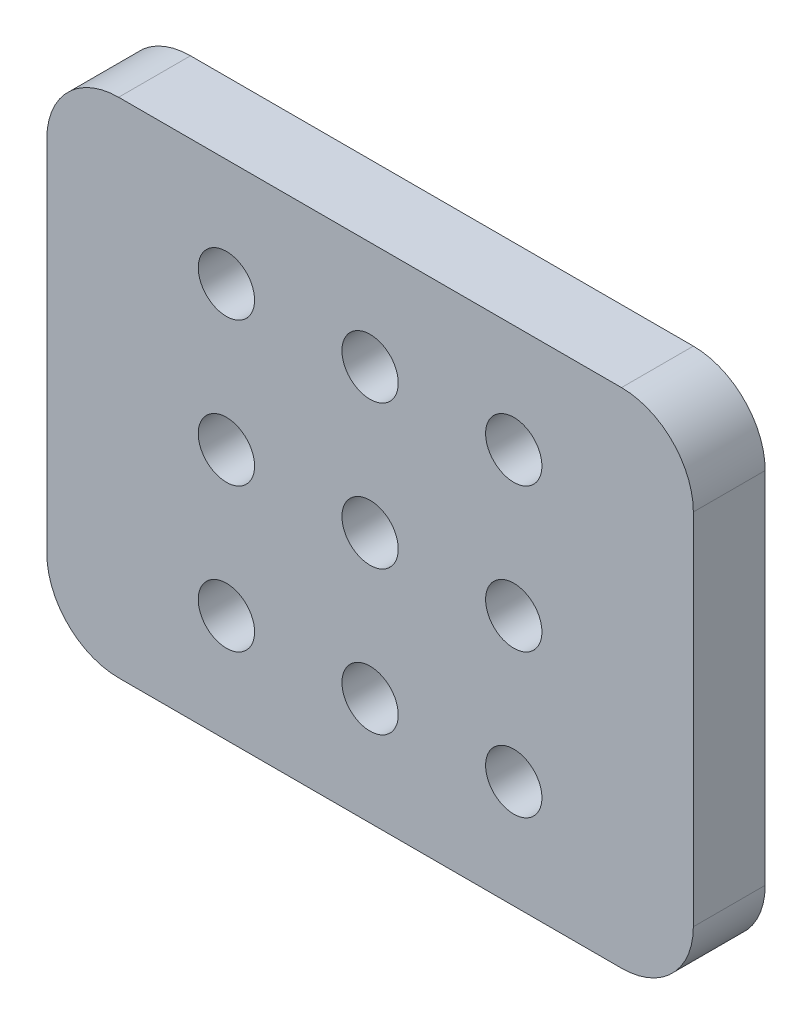
ISO-10303-21;
HEADER;
FILE_DESCRIPTION(('STEP AP214'),'2;1');
FILE_NAME('part.step','',(''),(''),'','','');
FILE_SCHEMA(('AUTOMOTIVE_DESIGN { 1 0 10303 214 1 1 1 1 }'));
ENDSEC;
DATA;
#1=APPLICATION_CONTEXT('core data for automotive mechanical design processes');
#2=APPLICATION_PROTOCOL_DEFINITION('international standard','automotive_design',2000,#1);
#3=PRODUCT_CONTEXT('',#1,'mechanical');
#4=PRODUCT('Part','Part','',(#3));
#5=PRODUCT_RELATED_PRODUCT_CATEGORY('part','',(#4));
#6=PRODUCT_DEFINITION_FORMATION('','',#4);
#7=PRODUCT_DEFINITION_CONTEXT('part definition',#1,'design');
#8=PRODUCT_DEFINITION('design','',#6,#7);
#9=PRODUCT_DEFINITION_SHAPE('','',#8);
#10=(LENGTH_UNIT() NAMED_UNIT(*) SI_UNIT(.MILLI.,.METRE.));
#11=(NAMED_UNIT(*) PLANE_ANGLE_UNIT() SI_UNIT($,.RADIAN.));
#12=(NAMED_UNIT(*) SI_UNIT($,.STERADIAN.) SOLID_ANGLE_UNIT());
#13=UNCERTAINTY_MEASURE_WITH_UNIT(LENGTH_MEASURE(1.E-05),#10,'distance_accuracy_value','');
#14=(GEOMETRIC_REPRESENTATION_CONTEXT(3) GLOBAL_UNCERTAINTY_ASSIGNED_CONTEXT((#13)) GLOBAL_UNIT_ASSIGNED_CONTEXT((#10,
#11,#12)) REPRESENTATION_CONTEXT('',''));
#15=CARTESIAN_POINT('',(0.,0.,0.));
#16=DIRECTION('',(0.,0.,1.));
#17=DIRECTION('',(1.,0.,0.));
#18=AXIS2_PLACEMENT_3D('',#15,#16,#17);
#19=CARTESIAN_POINT('',(0.,47.625,3.175));
#20=DIRECTION('',(0.,1.,0.));
#21=DIRECTION('',(0.,0.,1.));
#22=AXIS2_PLACEMENT_3D('',#19,#20,#21);
#23=PLANE('',#22);
#24=DIRECTION('',(1.,0.,0.));
#25=VECTOR('',#24,1.);
#26=CARTESIAN_POINT('',(0.,47.625,-3.175));
#27=LINE('',#26,#25);
#28=CARTESIAN_POINT('',(9.525,47.625,-3.175));
#29=VERTEX_POINT('',#28);
#30=CARTESIAN_POINT('',(53.975,47.625,-3.175));
#31=VERTEX_POINT('',#30);
#32=EDGE_CURVE('E170',#29,#31,#27,.T.);
#33=ORIENTED_EDGE('',*,*,#32,.F.);
#34=DIRECTION('',(0.,0.,-1.));
#35=VECTOR('',#34,1.);
#36=CARTESIAN_POINT('',(9.525,47.625,3.175));
#37=LINE('',#36,#35);
#38=CARTESIAN_POINT('',(9.525,47.625,3.175));
#39=VERTEX_POINT('',#38);
#40=EDGE_CURVE('E11',#29,#39,#37,.F.);
#41=ORIENTED_EDGE('',*,*,#40,.T.);
#42=DIRECTION('',(1.,0.,0.));
#43=VECTOR('',#42,1.);
#44=CARTESIAN_POINT('',(0.,47.625,3.175));
#45=LINE('',#44,#43);
#46=CARTESIAN_POINT('',(53.975,47.625,3.175));
#47=VERTEX_POINT('',#46);
#48=EDGE_CURVE('E172',#39,#47,#45,.T.);
#49=ORIENTED_EDGE('',*,*,#48,.T.);
#50=DIRECTION('',(0.,0.,-1.));
#51=VECTOR('',#50,1.);
#52=CARTESIAN_POINT('',(53.975,47.625,-3.175));
#53=LINE('',#52,#51);
#54=EDGE_CURVE('E45',#47,#31,#53,.T.);
#55=ORIENTED_EDGE('',*,*,#54,.T.);
#56=EDGE_LOOP('',(#33,#41,#49,#55));
#57=FACE_BOUND('',#56,.T.);
#58=ADVANCED_FACE('F37',(#57),#23,.T.);
#59=CARTESIAN_POINT('',(3.175,0.,3.175));
#60=DIRECTION('',(-1.,0.,0.));
#61=DIRECTION('',(0.,0.,1.));
#62=AXIS2_PLACEMENT_3D('',#59,#60,#61);
#63=PLANE('',#62);
#64=DIRECTION('',(0.,1.,0.));
#65=VECTOR('',#64,1.);
#66=CARTESIAN_POINT('',(3.175,0.,-3.175));
#67=LINE('',#66,#65);
#68=CARTESIAN_POINT('',(3.175,9.525,-3.175));
#69=VERTEX_POINT('',#68);
#70=CARTESIAN_POINT('',(3.175,41.275,-3.175));
#71=VERTEX_POINT('',#70);
#72=EDGE_CURVE('E136',#69,#71,#67,.T.);
#73=ORIENTED_EDGE('',*,*,#72,.F.);
#74=DIRECTION('',(0.,0.,-1.));
#75=VECTOR('',#74,1.);
#76=CARTESIAN_POINT('',(3.175,9.525,3.175));
#77=LINE('',#76,#75);
#78=CARTESIAN_POINT('',(3.175,9.525,3.175));
#79=VERTEX_POINT('',#78);
#80=EDGE_CURVE('E59',#69,#79,#77,.F.);
#81=ORIENTED_EDGE('',*,*,#80,.T.);
#82=DIRECTION('',(0.,1.,0.));
#83=VECTOR('',#82,1.);
#84=CARTESIAN_POINT('',(3.175,0.,3.175));
#85=LINE('',#84,#83);
#86=CARTESIAN_POINT('',(3.175,41.275,3.175));
#87=VERTEX_POINT('',#86);
#88=EDGE_CURVE('E208',#79,#87,#85,.T.);
#89=ORIENTED_EDGE('',*,*,#88,.T.);
#90=DIRECTION('',(0.,0.,-1.));
#91=VECTOR('',#90,1.);
#92=CARTESIAN_POINT('',(3.175,41.275,3.175));
#93=LINE('',#92,#91);
#94=EDGE_CURVE('E162',#87,#71,#93,.T.);
#95=ORIENTED_EDGE('',*,*,#94,.T.);
#96=EDGE_LOOP('',(#73,#81,#89,#95));
#97=FACE_BOUND('',#96,.T.);
#98=ADVANCED_FACE('F269',(#97),#63,.T.);
#99=CARTESIAN_POINT('',(0.,3.175,3.175));
#100=DIRECTION('',(0.,1.,0.));
#101=DIRECTION('',(0.,0.,1.));
#102=AXIS2_PLACEMENT_3D('',#99,#100,#101);
#103=PLANE('',#102);
#104=DIRECTION('',(1.,0.,0.));
#105=VECTOR('',#104,1.);
#106=CARTESIAN_POINT('',(0.,3.175,-3.175));
#107=LINE('',#106,#105);
#108=CARTESIAN_POINT('',(9.525,3.175,-3.175));
#109=VERTEX_POINT('',#108);
#110=CARTESIAN_POINT('',(53.975,3.175,-3.175));
#111=VERTEX_POINT('',#110);
#112=EDGE_CURVE('E131',#109,#111,#107,.T.);
#113=ORIENTED_EDGE('',*,*,#112,.T.);
#114=DIRECTION('',(0.,0.,-1.));
#115=VECTOR('',#114,1.);
#116=CARTESIAN_POINT('',(53.975,3.175,3.175));
#117=LINE('',#116,#115);
#118=CARTESIAN_POINT('',(53.975,3.175,3.175));
#119=VERTEX_POINT('',#118);
#120=EDGE_CURVE('E108',#111,#119,#117,.F.);
#121=ORIENTED_EDGE('',*,*,#120,.T.);
#122=DIRECTION('',(1.,0.,0.));
#123=VECTOR('',#122,1.);
#124=CARTESIAN_POINT('',(0.,3.175,3.175));
#125=LINE('',#124,#123);
#126=CARTESIAN_POINT('',(9.525,3.175,3.175));
#127=VERTEX_POINT('',#126);
#128=EDGE_CURVE('E205',#127,#119,#125,.T.);
#129=ORIENTED_EDGE('',*,*,#128,.F.);
#130=DIRECTION('',(0.,0.,-1.));
#131=VECTOR('',#130,1.);
#132=CARTESIAN_POINT('',(9.525,3.175,-3.175));
#133=LINE('',#132,#131);
#134=EDGE_CURVE('E113',#127,#109,#133,.T.);
#135=ORIENTED_EDGE('',*,*,#134,.T.);
#136=EDGE_LOOP('',(#113,#121,#129,#135));
#137=FACE_BOUND('',#136,.T.);
#138=ADVANCED_FACE('F274',(#137),#103,.F.);
#139=CARTESIAN_POINT('',(19.05,25.3999999999999,3.175));
#140=DIRECTION('',(0.,0.,-1.));
#141=DIRECTION('',(-1.,0.,0.));
#142=AXIS2_PLACEMENT_3D('',#139,#140,#141);
#143=CYLINDRICAL_SURFACE('',#142,2.4892);
#144=CARTESIAN_POINT('',(19.05,25.3999999999999,3.175));
#145=DIRECTION('',(0.,0.,1.));
#146=DIRECTION('',(1.,0.,0.));
#147=AXIS2_PLACEMENT_3D('',#144,#145,#146);
#148=CIRCLE('',#147,2.4892);
#149=CARTESIAN_POINT('',(21.5392,25.3999999999999,3.175));
#150=VERTEX_POINT('',#149);
#151=EDGE_CURVE('E198',#150,#150,#148,.T.);
#152=ORIENTED_EDGE('',*,*,#151,.T.);
#153=EDGE_LOOP('',(#152));
#154=FACE_BOUND('',#153,.T.);
#155=CARTESIAN_POINT('',(19.05,25.3999999999999,-3.175));
#156=DIRECTION('',(0.,0.,1.));
#157=DIRECTION('',(1.,0.,0.));
#158=AXIS2_PLACEMENT_3D('',#155,#156,#157);
#159=CIRCLE('',#158,2.4892);
#160=CARTESIAN_POINT('',(21.5392,25.3999999999999,-3.175));
#161=VERTEX_POINT('',#160);
#162=EDGE_CURVE('E134',#161,#161,#159,.T.);
#163=ORIENTED_EDGE('',*,*,#162,.F.);
#164=EDGE_LOOP('',(#163));
#165=FACE_BOUND('',#164,.T.);
#166=ADVANCED_FACE('F313',(#154,#165),#143,.F.);
#167=CARTESIAN_POINT('',(19.05,12.6999999999999,3.175));
#168=DIRECTION('',(0.,0.,-1.));
#169=DIRECTION('',(-1.,0.,0.));
#170=AXIS2_PLACEMENT_3D('',#167,#168,#169);
#171=CYLINDRICAL_SURFACE('',#170,2.4892);
#172=CARTESIAN_POINT('',(19.05,12.6999999999999,3.175));
#173=DIRECTION('',(0.,0.,1.));
#174=DIRECTION('',(1.,0.,0.));
#175=AXIS2_PLACEMENT_3D('',#172,#173,#174);
#176=CIRCLE('',#175,2.4892);
#177=CARTESIAN_POINT('',(21.5392,12.6999999999999,3.175));
#178=VERTEX_POINT('',#177);
#179=EDGE_CURVE('E201',#178,#178,#176,.T.);
#180=ORIENTED_EDGE('',*,*,#179,.T.);
#181=EDGE_LOOP('',(#180));
#182=FACE_BOUND('',#181,.T.);
#183=CARTESIAN_POINT('',(19.05,12.6999999999999,-3.175));
#184=DIRECTION('',(0.,0.,1.));
#185=DIRECTION('',(1.,0.,0.));
#186=AXIS2_PLACEMENT_3D('',#183,#184,#185);
#187=CIRCLE('',#186,2.4892);
#188=CARTESIAN_POINT('',(21.5392,12.6999999999999,-3.175));
#189=VERTEX_POINT('',#188);
#190=EDGE_CURVE('E130',#189,#189,#187,.T.);
#191=ORIENTED_EDGE('',*,*,#190,.F.);
#192=EDGE_LOOP('',(#191));
#193=FACE_BOUND('',#192,.T.);
#194=ADVANCED_FACE('F317',(#182,#193),#171,.F.);
#195=CARTESIAN_POINT('',(60.325,0.,3.175));
#196=DIRECTION('',(-1.,0.,0.));
#197=DIRECTION('',(0.,0.,1.));
#198=AXIS2_PLACEMENT_3D('',#195,#196,#197);
#199=PLANE('',#198);
#200=DIRECTION('',(0.,1.,0.));
#201=VECTOR('',#200,1.);
#202=CARTESIAN_POINT('',(60.325,0.,3.175));
#203=LINE('',#202,#201);
#204=CARTESIAN_POINT('',(60.325,9.525,3.175));
#205=VERTEX_POINT('',#204);
#206=CARTESIAN_POINT('',(60.325,41.275,3.175));
#207=VERTEX_POINT('',#206);
#208=EDGE_CURVE('E123',#205,#207,#203,.T.);
#209=ORIENTED_EDGE('',*,*,#208,.F.);
#210=DIRECTION('',(0.,0.,-1.));
#211=VECTOR('',#210,1.);
#212=CARTESIAN_POINT('',(60.325,9.525,3.175));
#213=LINE('',#212,#211);
#214=CARTESIAN_POINT('',(60.325,9.525,-3.175));
#215=VERTEX_POINT('',#214);
#216=EDGE_CURVE('E107',#205,#215,#213,.T.);
#217=ORIENTED_EDGE('',*,*,#216,.T.);
#218=DIRECTION('',(0.,1.,0.));
#219=VECTOR('',#218,1.);
#220=CARTESIAN_POINT('',(60.325,0.,-3.175));
#221=LINE('',#220,#219);
#222=CARTESIAN_POINT('',(60.325,41.275,-3.175));
#223=VERTEX_POINT('',#222);
#224=EDGE_CURVE('E120',#215,#223,#221,.T.);
#225=ORIENTED_EDGE('',*,*,#224,.T.);
#226=DIRECTION('',(0.,0.,-1.));
#227=VECTOR('',#226,1.);
#228=CARTESIAN_POINT('',(60.325,41.275,3.175));
#229=LINE('',#228,#227);
#230=EDGE_CURVE('E125',#223,#207,#229,.F.);
#231=ORIENTED_EDGE('',*,*,#230,.T.);
#232=EDGE_LOOP('',(#209,#217,#225,#231));
#233=FACE_BOUND('',#232,.T.);
#234=ADVANCED_FACE('F119',(#233),#199,.F.);
#235=CARTESIAN_POINT('',(44.45,38.1,3.175));
#236=DIRECTION('',(0.,0.,-1.));
#237=DIRECTION('',(-1.,0.,0.));
#238=AXIS2_PLACEMENT_3D('',#235,#236,#237);
#239=CYLINDRICAL_SURFACE('',#238,2.48919999999999);
#240=CARTESIAN_POINT('',(44.45,38.1,3.175));
#241=DIRECTION('',(0.,0.,1.));
#242=DIRECTION('',(1.,0.,0.));
#243=AXIS2_PLACEMENT_3D('',#240,#241,#242);
#244=CIRCLE('',#243,2.48919999999999);
#245=CARTESIAN_POINT('',(46.9392,38.1,3.175));
#246=VERTEX_POINT('',#245);
#247=EDGE_CURVE('E211',#246,#246,#244,.T.);
#248=ORIENTED_EDGE('',*,*,#247,.T.);
#249=EDGE_LOOP('',(#248));
#250=FACE_BOUND('',#249,.T.);
#251=CARTESIAN_POINT('',(44.45,38.1,-3.175));
#252=DIRECTION('',(0.,0.,1.));
#253=DIRECTION('',(1.,0.,0.));
#254=AXIS2_PLACEMENT_3D('',#251,#252,#253);
#255=CIRCLE('',#254,2.48919999999999);
#256=CARTESIAN_POINT('',(46.9392,38.1,-3.175));
#257=VERTEX_POINT('',#256);
#258=EDGE_CURVE('E176',#257,#257,#255,.T.);
#259=ORIENTED_EDGE('',*,*,#258,.F.);
#260=EDGE_LOOP('',(#259));
#261=FACE_BOUND('',#260,.T.);
#262=ADVANCED_FACE('F278',(#250,#261),#239,.F.);
#263=CARTESIAN_POINT('',(44.45,25.4,3.175));
#264=DIRECTION('',(0.,0.,-1.));
#265=DIRECTION('',(-1.,0.,0.));
#266=AXIS2_PLACEMENT_3D('',#263,#264,#265);
#267=CYLINDRICAL_SURFACE('',#266,2.48919999999999);
#268=CARTESIAN_POINT('',(44.45,25.4,3.175));
#269=DIRECTION('',(0.,0.,1.));
#270=DIRECTION('',(1.,0.,0.));
#271=AXIS2_PLACEMENT_3D('',#268,#269,#270);
#272=CIRCLE('',#271,2.48919999999999);
#273=CARTESIAN_POINT('',(46.9392,25.4,3.175));
#274=VERTEX_POINT('',#273);
#275=EDGE_CURVE('E214',#274,#274,#272,.T.);
#276=ORIENTED_EDGE('',*,*,#275,.T.);
#277=EDGE_LOOP('',(#276));
#278=FACE_BOUND('',#277,.T.);
#279=CARTESIAN_POINT('',(44.45,25.4,-3.175));
#280=DIRECTION('',(0.,0.,1.));
#281=DIRECTION('',(1.,0.,0.));
#282=AXIS2_PLACEMENT_3D('',#279,#280,#281);
#283=CIRCLE('',#282,2.48919999999999);
#284=CARTESIAN_POINT('',(46.9392,25.4,-3.175));
#285=VERTEX_POINT('',#284);
#286=EDGE_CURVE('E179',#285,#285,#283,.T.);
#287=ORIENTED_EDGE('',*,*,#286,.F.);
#288=EDGE_LOOP('',(#287));
#289=FACE_BOUND('',#288,.T.);
#290=ADVANCED_FACE('F281',(#278,#289),#267,.F.);
#291=CARTESIAN_POINT('',(44.45,12.7,3.175));
#292=DIRECTION('',(0.,0.,-1.));
#293=DIRECTION('',(-1.,0.,0.));
#294=AXIS2_PLACEMENT_3D('',#291,#292,#293);
#295=CYLINDRICAL_SURFACE('',#294,2.48919999999999);
#296=CARTESIAN_POINT('',(44.45,12.7,3.175));
#297=DIRECTION('',(0.,0.,1.));
#298=DIRECTION('',(1.,0.,0.));
#299=AXIS2_PLACEMENT_3D('',#296,#297,#298);
#300=CIRCLE('',#299,2.48919999999999);
#301=CARTESIAN_POINT('',(46.9392,12.7,3.175));
#302=VERTEX_POINT('',#301);
#303=EDGE_CURVE('E217',#302,#302,#300,.T.);
#304=ORIENTED_EDGE('',*,*,#303,.T.);
#305=EDGE_LOOP('',(#304));
#306=FACE_BOUND('',#305,.T.);
#307=CARTESIAN_POINT('',(44.45,12.7,-3.175));
#308=DIRECTION('',(0.,0.,1.));
#309=DIRECTION('',(1.,0.,0.));
#310=AXIS2_PLACEMENT_3D('',#307,#308,#309);
#311=CIRCLE('',#310,2.48919999999999);
#312=CARTESIAN_POINT('',(46.9392,12.7,-3.175));
#313=VERTEX_POINT('',#312);
#314=EDGE_CURVE('E184',#313,#313,#311,.T.);
#315=ORIENTED_EDGE('',*,*,#314,.F.);
#316=EDGE_LOOP('',(#315));
#317=FACE_BOUND('',#316,.T.);
#318=ADVANCED_FACE('F285',(#306,#317),#295,.F.);
#319=CARTESIAN_POINT('',(31.75,12.7,3.175));
#320=DIRECTION('',(0.,0.,-1.));
#321=DIRECTION('',(-1.,0.,0.));
#322=AXIS2_PLACEMENT_3D('',#319,#320,#321);
#323=CYLINDRICAL_SURFACE('',#322,2.4892);
#324=CARTESIAN_POINT('',(31.75,12.7,3.175));
#325=DIRECTION('',(0.,0.,1.));
#326=DIRECTION('',(1.,0.,0.));
#327=AXIS2_PLACEMENT_3D('',#324,#325,#326);
#328=CIRCLE('',#327,2.4892);
#329=CARTESIAN_POINT('',(34.2392,12.7,3.175));
#330=VERTEX_POINT('',#329);
#331=EDGE_CURVE('E220',#330,#330,#328,.T.);
#332=ORIENTED_EDGE('',*,*,#331,.T.);
#333=EDGE_LOOP('',(#332));
#334=FACE_BOUND('',#333,.T.);
#335=CARTESIAN_POINT('',(31.75,12.7,-3.175));
#336=DIRECTION('',(0.,0.,1.));
#337=DIRECTION('',(1.,0.,0.));
#338=AXIS2_PLACEMENT_3D('',#335,#336,#337);
#339=CIRCLE('',#338,2.4892);
#340=CARTESIAN_POINT('',(34.2392,12.7,-3.175));
#341=VERTEX_POINT('',#340);
#342=EDGE_CURVE('E187',#341,#341,#339,.T.);
#343=ORIENTED_EDGE('',*,*,#342,.F.);
#344=EDGE_LOOP('',(#343));
#345=FACE_BOUND('',#344,.T.);
#346=ADVANCED_FACE('F289',(#334,#345),#323,.F.);
#347=CARTESIAN_POINT('',(31.75,25.4,3.175));
#348=DIRECTION('',(0.,0.,-1.));
#349=DIRECTION('',(-1.,0.,0.));
#350=AXIS2_PLACEMENT_3D('',#347,#348,#349);
#351=CYLINDRICAL_SURFACE('',#350,2.4892);
#352=CARTESIAN_POINT('',(31.75,25.4,3.175));
#353=DIRECTION('',(0.,0.,1.));
#354=DIRECTION('',(1.,0.,0.));
#355=AXIS2_PLACEMENT_3D('',#352,#353,#354);
#356=CIRCLE('',#355,2.4892);
#357=CARTESIAN_POINT('',(34.2392,25.4,3.175));
#358=VERTEX_POINT('',#357);
#359=EDGE_CURVE('E223',#358,#358,#356,.T.);
#360=ORIENTED_EDGE('',*,*,#359,.T.);
#361=EDGE_LOOP('',(#360));
#362=FACE_BOUND('',#361,.T.);
#363=CARTESIAN_POINT('',(31.75,25.4,-3.175));
#364=DIRECTION('',(0.,0.,1.));
#365=DIRECTION('',(1.,0.,0.));
#366=AXIS2_PLACEMENT_3D('',#363,#364,#365);
#367=CIRCLE('',#366,2.4892);
#368=CARTESIAN_POINT('',(34.2392,25.4,-3.175));
#369=VERTEX_POINT('',#368);
#370=EDGE_CURVE('E190',#369,#369,#367,.T.);
#371=ORIENTED_EDGE('',*,*,#370,.F.);
#372=EDGE_LOOP('',(#371));
#373=FACE_BOUND('',#372,.T.);
#374=ADVANCED_FACE('F293',(#362,#373),#351,.F.);
#375=CARTESIAN_POINT('',(31.75,38.1,3.175));
#376=DIRECTION('',(0.,0.,-1.));
#377=DIRECTION('',(-1.,0.,0.));
#378=AXIS2_PLACEMENT_3D('',#375,#376,#377);
#379=CYLINDRICAL_SURFACE('',#378,2.4892);
#380=CARTESIAN_POINT('',(31.75,38.1,3.175));
#381=DIRECTION('',(0.,0.,1.));
#382=DIRECTION('',(1.,0.,0.));
#383=AXIS2_PLACEMENT_3D('',#380,#381,#382);
#384=CIRCLE('',#383,2.4892);
#385=CARTESIAN_POINT('',(34.2392,38.1,3.175));
#386=VERTEX_POINT('',#385);
#387=EDGE_CURVE('E145',#386,#386,#384,.T.);
#388=ORIENTED_EDGE('',*,*,#387,.T.);
#389=EDGE_LOOP('',(#388));
#390=FACE_BOUND('',#389,.T.);
#391=CARTESIAN_POINT('',(31.75,38.1,-3.175));
#392=DIRECTION('',(0.,0.,1.));
#393=DIRECTION('',(1.,0.,0.));
#394=AXIS2_PLACEMENT_3D('',#391,#392,#393);
#395=CIRCLE('',#394,2.4892);
#396=CARTESIAN_POINT('',(34.2392,38.1,-3.175));
#397=VERTEX_POINT('',#396);
#398=EDGE_CURVE('E193',#397,#397,#395,.T.);
#399=ORIENTED_EDGE('',*,*,#398,.F.);
#400=EDGE_LOOP('',(#399));
#401=FACE_BOUND('',#400,.T.);
#402=ADVANCED_FACE('F229',(#390,#401),#379,.F.);
#403=CARTESIAN_POINT('',(19.05,38.0999999999999,3.175));
#404=DIRECTION('',(0.,0.,-1.));
#405=DIRECTION('',(-1.,0.,0.));
#406=AXIS2_PLACEMENT_3D('',#403,#404,#405);
#407=CYLINDRICAL_SURFACE('',#406,2.4892);
#408=CARTESIAN_POINT('',(19.05,38.0999999999999,3.175));
#409=DIRECTION('',(0.,0.,1.));
#410=DIRECTION('',(1.,0.,0.));
#411=AXIS2_PLACEMENT_3D('',#408,#409,#410);
#412=CIRCLE('',#411,2.4892);
#413=CARTESIAN_POINT('',(21.5392,38.0999999999999,3.175));
#414=VERTEX_POINT('',#413);
#415=EDGE_CURVE('E146',#414,#414,#412,.T.);
#416=ORIENTED_EDGE('',*,*,#415,.T.);
#417=EDGE_LOOP('',(#416));
#418=FACE_BOUND('',#417,.T.);
#419=CARTESIAN_POINT('',(19.05,38.0999999999999,-3.175));
#420=DIRECTION('',(0.,0.,1.));
#421=DIRECTION('',(1.,0.,0.));
#422=AXIS2_PLACEMENT_3D('',#419,#420,#421);
#423=CIRCLE('',#422,2.4892);
#424=CARTESIAN_POINT('',(21.5392,38.0999999999999,-3.175));
#425=VERTEX_POINT('',#424);
#426=EDGE_CURVE('E142',#425,#425,#423,.T.);
#427=ORIENTED_EDGE('',*,*,#426,.F.);
#428=EDGE_LOOP('',(#427));
#429=FACE_BOUND('',#428,.T.);
#430=ADVANCED_FACE('F235',(#418,#429),#407,.F.);
#431=CARTESIAN_POINT('',(0.,0.,3.175));
#432=DIRECTION('',(0.,0.,1.));
#433=DIRECTION('',(1.,0.,0.));
#434=AXIS2_PLACEMENT_3D('',#431,#432,#433);
#435=PLANE('',#434);
#436=ORIENTED_EDGE('',*,*,#387,.F.);
#437=EDGE_LOOP('',(#436));
#438=FACE_BOUND('',#437,.T.);
#439=ORIENTED_EDGE('',*,*,#359,.F.);
#440=EDGE_LOOP('',(#439));
#441=FACE_BOUND('',#440,.T.);
#442=ORIENTED_EDGE('',*,*,#331,.F.);
#443=EDGE_LOOP('',(#442));
#444=FACE_BOUND('',#443,.T.);
#445=ORIENTED_EDGE('',*,*,#303,.F.);
#446=EDGE_LOOP('',(#445));
#447=FACE_BOUND('',#446,.T.);
#448=ORIENTED_EDGE('',*,*,#275,.F.);
#449=EDGE_LOOP('',(#448));
#450=FACE_BOUND('',#449,.T.);
#451=ORIENTED_EDGE('',*,*,#247,.F.);
#452=EDGE_LOOP('',(#451));
#453=FACE_BOUND('',#452,.T.);
#454=ORIENTED_EDGE('',*,*,#128,.T.);
#455=CARTESIAN_POINT('',(53.975,9.525,3.175));
#456=DIRECTION('',(0.,0.,1.));
#457=DIRECTION('',(1.,0.,0.));
#458=AXIS2_PLACEMENT_3D('',#455,#456,#457);
#459=CIRCLE('',#458,6.35);
#460=EDGE_CURVE('E160',#119,#205,#459,.T.);
#461=ORIENTED_EDGE('',*,*,#460,.T.);
#462=ORIENTED_EDGE('',*,*,#208,.T.);
#463=CARTESIAN_POINT('',(53.975,41.275,3.175));
#464=DIRECTION('',(0.,0.,1.));
#465=DIRECTION('',(1.,0.,0.));
#466=AXIS2_PLACEMENT_3D('',#463,#464,#465);
#467=CIRCLE('',#466,6.35);
#468=EDGE_CURVE('E155',#207,#47,#467,.T.);
#469=ORIENTED_EDGE('',*,*,#468,.T.);
#470=ORIENTED_EDGE('',*,*,#48,.F.);
#471=CARTESIAN_POINT('',(9.525,41.275,3.175));
#472=DIRECTION('',(0.,0.,1.));
#473=DIRECTION('',(1.,0.,0.));
#474=AXIS2_PLACEMENT_3D('',#471,#472,#473);
#475=CIRCLE('',#474,6.35);
#476=EDGE_CURVE('E52',#39,#87,#475,.T.);
#477=ORIENTED_EDGE('',*,*,#476,.T.);
#478=ORIENTED_EDGE('',*,*,#88,.F.);
#479=CARTESIAN_POINT('',(9.525,9.525,3.175));
#480=DIRECTION('',(0.,0.,1.));
#481=DIRECTION('',(1.,0.,0.));
#482=AXIS2_PLACEMENT_3D('',#479,#480,#481);
#483=CIRCLE('',#482,6.35);
#484=EDGE_CURVE('E158',#79,#127,#483,.T.);
#485=ORIENTED_EDGE('',*,*,#484,.T.);
#486=EDGE_LOOP('',(#454,#461,#462,#469,#470,#477,#478,#485));
#487=FACE_BOUND('',#486,.T.);
#488=ORIENTED_EDGE('',*,*,#179,.F.);
#489=EDGE_LOOP('',(#488));
#490=FACE_BOUND('',#489,.T.);
#491=ORIENTED_EDGE('',*,*,#151,.F.);
#492=EDGE_LOOP('',(#491));
#493=FACE_BOUND('',#492,.T.);
#494=ORIENTED_EDGE('',*,*,#415,.F.);
#495=EDGE_LOOP('',(#494));
#496=FACE_BOUND('',#495,.T.);
#497=ADVANCED_FACE('F232',(#438,#441,#444,#447,#450,#453,#487,#490,#493,#496),#435,.T.);
#498=CARTESIAN_POINT('',(0.,0.,-3.175));
#499=DIRECTION('',(0.,0.,1.));
#500=DIRECTION('',(1.,0.,0.));
#501=AXIS2_PLACEMENT_3D('',#498,#499,#500);
#502=PLANE('',#501);
#503=ORIENTED_EDGE('',*,*,#398,.T.);
#504=EDGE_LOOP('',(#503));
#505=FACE_BOUND('',#504,.T.);
#506=ORIENTED_EDGE('',*,*,#370,.T.);
#507=EDGE_LOOP('',(#506));
#508=FACE_BOUND('',#507,.T.);
#509=ORIENTED_EDGE('',*,*,#342,.T.);
#510=EDGE_LOOP('',(#509));
#511=FACE_BOUND('',#510,.T.);
#512=ORIENTED_EDGE('',*,*,#314,.T.);
#513=EDGE_LOOP('',(#512));
#514=FACE_BOUND('',#513,.T.);
#515=ORIENTED_EDGE('',*,*,#286,.T.);
#516=EDGE_LOOP('',(#515));
#517=FACE_BOUND('',#516,.T.);
#518=ORIENTED_EDGE('',*,*,#258,.T.);
#519=EDGE_LOOP('',(#518));
#520=FACE_BOUND('',#519,.T.);
#521=ORIENTED_EDGE('',*,*,#224,.F.);
#522=CARTESIAN_POINT('',(53.975,9.525,-3.175));
#523=DIRECTION('',(0.,0.,1.));
#524=DIRECTION('',(1.,0.,0.));
#525=AXIS2_PLACEMENT_3D('',#522,#523,#524);
#526=CIRCLE('',#525,6.35);
#527=EDGE_CURVE('E103',#215,#111,#526,.F.);
#528=ORIENTED_EDGE('',*,*,#527,.T.);
#529=ORIENTED_EDGE('',*,*,#112,.F.);
#530=CARTESIAN_POINT('',(9.525,9.525,-3.175));
#531=DIRECTION('',(0.,0.,1.));
#532=DIRECTION('',(1.,0.,0.));
#533=AXIS2_PLACEMENT_3D('',#530,#531,#532);
#534=CIRCLE('',#533,6.35);
#535=EDGE_CURVE('E114',#109,#69,#534,.F.);
#536=ORIENTED_EDGE('',*,*,#535,.T.);
#537=ORIENTED_EDGE('',*,*,#72,.T.);
#538=CARTESIAN_POINT('',(9.525,41.275,-3.175));
#539=DIRECTION('',(0.,0.,1.));
#540=DIRECTION('',(1.,0.,0.));
#541=AXIS2_PLACEMENT_3D('',#538,#539,#540);
#542=CIRCLE('',#541,6.35);
#543=EDGE_CURVE('E149',#71,#29,#542,.F.);
#544=ORIENTED_EDGE('',*,*,#543,.T.);
#545=ORIENTED_EDGE('',*,*,#32,.T.);
#546=CARTESIAN_POINT('',(53.975,41.275,-3.175));
#547=DIRECTION('',(0.,0.,1.));
#548=DIRECTION('',(1.,0.,0.));
#549=AXIS2_PLACEMENT_3D('',#546,#547,#548);
#550=CIRCLE('',#549,6.35);
#551=EDGE_CURVE('E124',#31,#223,#550,.F.);
#552=ORIENTED_EDGE('',*,*,#551,.T.);
#553=EDGE_LOOP('',(#521,#528,#529,#536,#537,#544,#545,#552));
#554=FACE_BOUND('',#553,.T.);
#555=ORIENTED_EDGE('',*,*,#190,.T.);
#556=EDGE_LOOP('',(#555));
#557=FACE_BOUND('',#556,.T.);
#558=ORIENTED_EDGE('',*,*,#162,.T.);
#559=EDGE_LOOP('',(#558));
#560=FACE_BOUND('',#559,.T.);
#561=ORIENTED_EDGE('',*,*,#426,.T.);
#562=EDGE_LOOP('',(#561));
#563=FACE_BOUND('',#562,.T.);
#564=ADVANCED_FACE('F127',(#505,#508,#511,#514,#517,#520,#554,#557,#560,#563),#502,.F.);
#565=CARTESIAN_POINT('',(53.975,9.525,3.175));
#566=DIRECTION('',(0.,0.,-1.));
#567=DIRECTION('',(-1.,0.,0.));
#568=AXIS2_PLACEMENT_3D('',#565,#566,#567);
#569=CYLINDRICAL_SURFACE('',#568,6.35);
#570=ORIENTED_EDGE('',*,*,#460,.F.);
#571=ORIENTED_EDGE('',*,*,#120,.F.);
#572=ORIENTED_EDGE('',*,*,#527,.F.);
#573=ORIENTED_EDGE('',*,*,#216,.F.);
#574=EDGE_LOOP('',(#570,#571,#572,#573));
#575=FACE_BOUND('',#574,.T.);
#576=ADVANCED_FACE('F106',(#575),#569,.T.);
#577=CARTESIAN_POINT('',(9.525,9.525,3.175));
#578=DIRECTION('',(0.,0.,1.));
#579=DIRECTION('',(1.,0.,0.));
#580=AXIS2_PLACEMENT_3D('',#577,#578,#579);
#581=CYLINDRICAL_SURFACE('',#580,6.35);
#582=ORIENTED_EDGE('',*,*,#484,.F.);
#583=ORIENTED_EDGE('',*,*,#80,.F.);
#584=ORIENTED_EDGE('',*,*,#535,.F.);
#585=ORIENTED_EDGE('',*,*,#134,.F.);
#586=EDGE_LOOP('',(#582,#583,#584,#585));
#587=FACE_BOUND('',#586,.T.);
#588=ADVANCED_FACE('F265',(#587),#581,.T.);
#589=CARTESIAN_POINT('',(9.525,41.275,3.175));
#590=DIRECTION('',(0.,0.,-1.));
#591=DIRECTION('',(-1.,0.,0.));
#592=AXIS2_PLACEMENT_3D('',#589,#590,#591);
#593=CYLINDRICAL_SURFACE('',#592,6.35);
#594=ORIENTED_EDGE('',*,*,#476,.F.);
#595=ORIENTED_EDGE('',*,*,#40,.F.);
#596=ORIENTED_EDGE('',*,*,#543,.F.);
#597=ORIENTED_EDGE('',*,*,#94,.F.);
#598=EDGE_LOOP('',(#594,#595,#596,#597));
#599=FACE_BOUND('',#598,.T.);
#600=ADVANCED_FACE('F301',(#599),#593,.T.);
#601=CARTESIAN_POINT('',(53.975,41.275,3.175));
#602=DIRECTION('',(0.,0.,1.));
#603=DIRECTION('',(1.,0.,0.));
#604=AXIS2_PLACEMENT_3D('',#601,#602,#603);
#605=CYLINDRICAL_SURFACE('',#604,6.35);
#606=ORIENTED_EDGE('',*,*,#468,.F.);
#607=ORIENTED_EDGE('',*,*,#230,.F.);
#608=ORIENTED_EDGE('',*,*,#551,.F.);
#609=ORIENTED_EDGE('',*,*,#54,.F.);
#610=EDGE_LOOP('',(#606,#607,#608,#609));
#611=FACE_BOUND('',#610,.T.);
#612=ADVANCED_FACE('F39',(#611),#605,.T.);
#613=CLOSED_SHELL('',(#58,#98,#138,#166,#194,#234,#262,#290,#318,#346,#374,#402,#430,#497,#564,
#576,#588,#600,#612));
#614=MANIFOLD_SOLID_BREP('B2',#613);
#615=ADVANCED_BREP_SHAPE_REPRESENTATION('',(#18,#614),#14);
#616=SHAPE_DEFINITION_REPRESENTATION(#9,#615);
ENDSEC;
END-ISO-10303-21;
